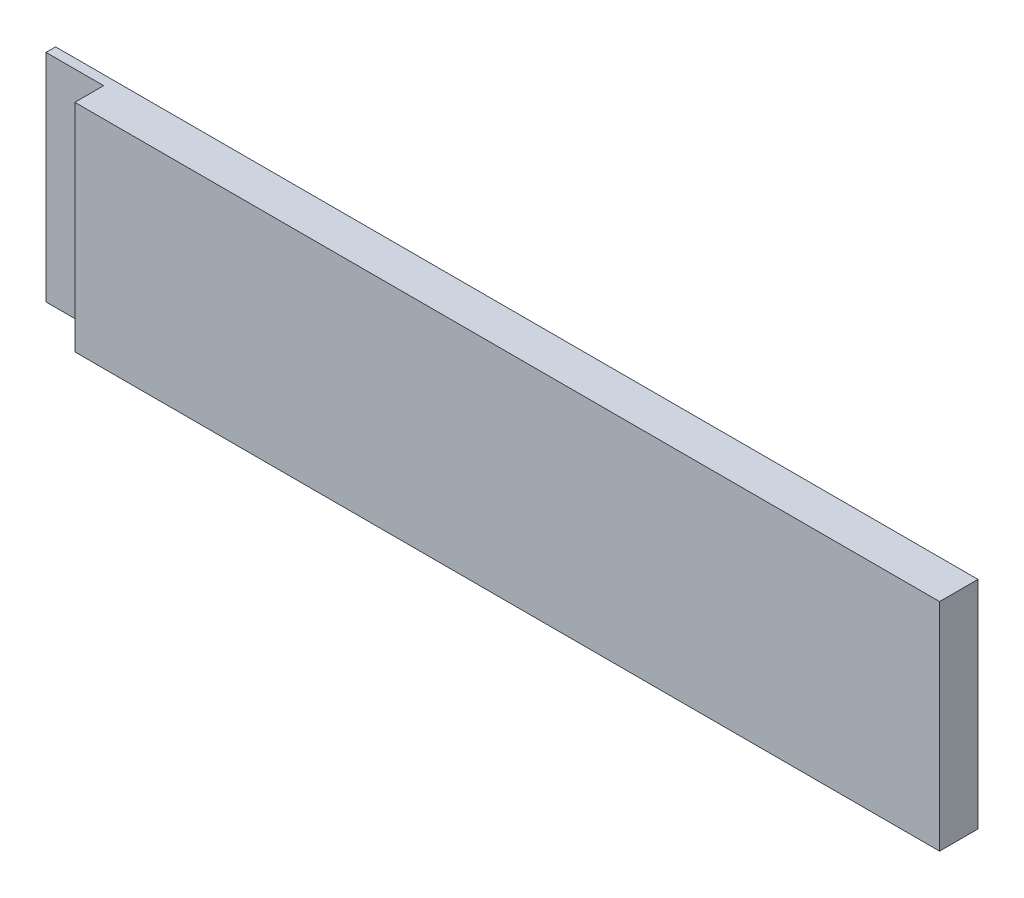
ISO-10303-21;
HEADER;
FILE_DESCRIPTION(('STEP AP214'),'2;1');
FILE_NAME('part.step','',(''),(''),'','','');
FILE_SCHEMA(('AUTOMOTIVE_DESIGN { 1 0 10303 214 1 1 1 1 }'));
ENDSEC;
DATA;
#1=APPLICATION_CONTEXT('core data for automotive mechanical design processes');
#2=APPLICATION_PROTOCOL_DEFINITION('international standard','automotive_design',2000,#1);
#3=PRODUCT_CONTEXT('',#1,'mechanical');
#4=PRODUCT('Part','Part','',(#3));
#5=PRODUCT_RELATED_PRODUCT_CATEGORY('part','',(#4));
#6=PRODUCT_DEFINITION_FORMATION('','',#4);
#7=PRODUCT_DEFINITION_CONTEXT('part definition',#1,'design');
#8=PRODUCT_DEFINITION('design','',#6,#7);
#9=PRODUCT_DEFINITION_SHAPE('','',#8);
#10=(LENGTH_UNIT() NAMED_UNIT(*) SI_UNIT(.MILLI.,.METRE.));
#11=(NAMED_UNIT(*) PLANE_ANGLE_UNIT() SI_UNIT($,.RADIAN.));
#12=(NAMED_UNIT(*) SI_UNIT($,.STERADIAN.) SOLID_ANGLE_UNIT());
#13=UNCERTAINTY_MEASURE_WITH_UNIT(LENGTH_MEASURE(1.E-05),#10,'distance_accuracy_value','');
#14=(GEOMETRIC_REPRESENTATION_CONTEXT(3) GLOBAL_UNCERTAINTY_ASSIGNED_CONTEXT((#13)) GLOBAL_UNIT_ASSIGNED_CONTEXT((#10,
#11,#12)) REPRESENTATION_CONTEXT('',''));
#15=CARTESIAN_POINT('',(0.,0.,0.));
#16=DIRECTION('',(0.,0.,1.));
#17=DIRECTION('',(1.,0.,0.));
#18=AXIS2_PLACEMENT_3D('',#15,#16,#17);
#19=CARTESIAN_POINT('',(-152.4,-35.7124,12.7));
#20=DIRECTION('',(0.,1.,0.));
#21=DIRECTION('',(0.,0.,1.));
#22=AXIS2_PLACEMENT_3D('',#19,#20,#21);
#23=PLANE('',#22);
#24=DIRECTION('',(0.,0.,1.));
#25=VECTOR('',#24,1.);
#26=CARTESIAN_POINT('',(-133.35,-35.7124,3.175));
#27=LINE('',#26,#25);
#28=CARTESIAN_POINT('',(-133.35,-35.7124,3.175));
#29=VERTEX_POINT('',#28);
#30=CARTESIAN_POINT('',(-133.35,-35.7124,12.7));
#31=VERTEX_POINT('',#30);
#32=EDGE_CURVE('E57',#29,#31,#27,.T.);
#33=ORIENTED_EDGE('',*,*,#32,.F.);
#34=DIRECTION('',(1.,0.,0.));
#35=VECTOR('',#34,1.);
#36=CARTESIAN_POINT('',(-152.4,-35.7124,3.175));
#37=LINE('',#36,#35);
#38=CARTESIAN_POINT('',(-152.4,-35.7124,3.175));
#39=VERTEX_POINT('',#38);
#40=EDGE_CURVE('E89',#39,#29,#37,.T.);
#41=ORIENTED_EDGE('',*,*,#40,.F.);
#42=DIRECTION('',(0.,0.,-1.));
#43=VECTOR('',#42,1.);
#44=CARTESIAN_POINT('',(-152.4,-35.7124,12.7));
#45=LINE('',#44,#43);
#46=CARTESIAN_POINT('',(-152.4,-35.7124,0.));
#47=VERTEX_POINT('',#46);
#48=EDGE_CURVE('E11',#39,#47,#45,.T.);
#49=ORIENTED_EDGE('',*,*,#48,.T.);
#50=DIRECTION('',(1.,0.,0.));
#51=VECTOR('',#50,1.);
#52=CARTESIAN_POINT('',(-152.4,-35.7124,0.));
#53=LINE('',#52,#51);
#54=CARTESIAN_POINT('',(152.4,-35.7124,0.));
#55=VERTEX_POINT('',#54);
#56=EDGE_CURVE('E85',#47,#55,#53,.T.);
#57=ORIENTED_EDGE('',*,*,#56,.T.);
#58=DIRECTION('',(0.,0.,-1.));
#59=VECTOR('',#58,1.);
#60=CARTESIAN_POINT('',(152.4,-35.7124,12.7));
#61=LINE('',#60,#59);
#62=CARTESIAN_POINT('',(152.4,-35.7124,12.7));
#63=VERTEX_POINT('',#62);
#64=EDGE_CURVE('E49',#63,#55,#61,.T.);
#65=ORIENTED_EDGE('',*,*,#64,.F.);
#66=DIRECTION('',(1.,0.,0.));
#67=VECTOR('',#66,1.);
#68=CARTESIAN_POINT('',(-152.4,-35.7124,12.7));
#69=LINE('',#68,#67);
#70=EDGE_CURVE('E65',#31,#63,#69,.T.);
#71=ORIENTED_EDGE('',*,*,#70,.F.);
#72=EDGE_LOOP('',(#33,#41,#49,#57,#65,#71));
#73=FACE_BOUND('',#72,.T.);
#74=ADVANCED_FACE('F39',(#73),#23,.F.);
#75=CARTESIAN_POINT('',(-152.4,35.7124,12.7));
#76=DIRECTION('',(0.,1.,0.));
#77=DIRECTION('',(0.,0.,1.));
#78=AXIS2_PLACEMENT_3D('',#75,#76,#77);
#79=PLANE('',#78);
#80=DIRECTION('',(1.,0.,0.));
#81=VECTOR('',#80,1.);
#82=CARTESIAN_POINT('',(-152.4,35.7124,3.175));
#83=LINE('',#82,#81);
#84=CARTESIAN_POINT('',(-152.4,35.7124,3.175));
#85=VERTEX_POINT('',#84);
#86=CARTESIAN_POINT('',(-133.35,35.7124,3.175));
#87=VERTEX_POINT('',#86);
#88=EDGE_CURVE('E140',#85,#87,#83,.T.);
#89=ORIENTED_EDGE('',*,*,#88,.T.);
#90=DIRECTION('',(0.,0.,1.));
#91=VECTOR('',#90,1.);
#92=CARTESIAN_POINT('',(-133.35,35.7124,3.175));
#93=LINE('',#92,#91);
#94=CARTESIAN_POINT('',(-133.35,35.7124,12.7));
#95=VERTEX_POINT('',#94);
#96=EDGE_CURVE('E108',#87,#95,#93,.T.);
#97=ORIENTED_EDGE('',*,*,#96,.T.);
#98=DIRECTION('',(1.,0.,0.));
#99=VECTOR('',#98,1.);
#100=CARTESIAN_POINT('',(-152.4,35.7124,12.7));
#101=LINE('',#100,#99);
#102=CARTESIAN_POINT('',(152.4,35.7124,12.7));
#103=VERTEX_POINT('',#102);
#104=EDGE_CURVE('E102',#95,#103,#101,.T.);
#105=ORIENTED_EDGE('',*,*,#104,.T.);
#106=DIRECTION('',(0.,0.,-1.));
#107=VECTOR('',#106,1.);
#108=CARTESIAN_POINT('',(152.4,35.7124,12.7));
#109=LINE('',#108,#107);
#110=CARTESIAN_POINT('',(152.4,35.7124,0.));
#111=VERTEX_POINT('',#110);
#112=EDGE_CURVE('E121',#103,#111,#109,.T.);
#113=ORIENTED_EDGE('',*,*,#112,.T.);
#114=DIRECTION('',(1.,0.,0.));
#115=VECTOR('',#114,1.);
#116=CARTESIAN_POINT('',(-152.4,35.7124,0.));
#117=LINE('',#116,#115);
#118=CARTESIAN_POINT('',(-152.4,35.7124,0.));
#119=VERTEX_POINT('',#118);
#120=EDGE_CURVE('E107',#119,#111,#117,.T.);
#121=ORIENTED_EDGE('',*,*,#120,.F.);
#122=DIRECTION('',(0.,0.,-1.));
#123=VECTOR('',#122,1.);
#124=CARTESIAN_POINT('',(-152.4,35.7124,12.7));
#125=LINE('',#124,#123);
#126=EDGE_CURVE('E43',#85,#119,#125,.T.);
#127=ORIENTED_EDGE('',*,*,#126,.F.);
#128=EDGE_LOOP('',(#89,#97,#105,#113,#121,#127));
#129=FACE_BOUND('',#128,.T.);
#130=ADVANCED_FACE('F153',(#129),#79,.T.);
#131=CARTESIAN_POINT('',(0.,0.,12.7));
#132=DIRECTION('',(0.,0.,-1.));
#133=DIRECTION('',(-1.,0.,0.));
#134=AXIS2_PLACEMENT_3D('',#131,#132,#133);
#135=PLANE('',#134);
#136=DIRECTION('',(0.,-1.,0.));
#137=VECTOR('',#136,1.);
#138=CARTESIAN_POINT('',(-133.35,35.7124,12.7));
#139=LINE('',#138,#137);
#140=EDGE_CURVE('E137',#95,#31,#139,.T.);
#141=ORIENTED_EDGE('',*,*,#140,.T.);
#142=ORIENTED_EDGE('',*,*,#70,.T.);
#143=DIRECTION('',(0.,1.,0.));
#144=VECTOR('',#143,1.);
#145=CARTESIAN_POINT('',(152.4,-35.7124,12.7));
#146=LINE('',#145,#144);
#147=EDGE_CURVE('E127',#63,#103,#146,.T.);
#148=ORIENTED_EDGE('',*,*,#147,.T.);
#149=ORIENTED_EDGE('',*,*,#104,.F.);
#150=EDGE_LOOP('',(#141,#142,#148,#149));
#151=FACE_BOUND('',#150,.T.);
#152=ADVANCED_FACE('F165',(#151),#135,.F.);
#153=CARTESIAN_POINT('',(-152.4,-35.7124,12.7));
#154=DIRECTION('',(-1.,0.,0.));
#155=DIRECTION('',(0.,0.,1.));
#156=AXIS2_PLACEMENT_3D('',#153,#154,#155);
#157=PLANE('',#156);
#158=DIRECTION('',(0.,-1.,0.));
#159=VECTOR('',#158,1.);
#160=CARTESIAN_POINT('',(-152.4,35.7124,3.175));
#161=LINE('',#160,#159);
#162=EDGE_CURVE('E136',#85,#39,#161,.T.);
#163=ORIENTED_EDGE('',*,*,#162,.F.);
#164=ORIENTED_EDGE('',*,*,#126,.T.);
#165=DIRECTION('',(0.,1.,0.));
#166=VECTOR('',#165,1.);
#167=CARTESIAN_POINT('',(-152.4,-35.7124,0.));
#168=LINE('',#167,#166);
#169=EDGE_CURVE('E98',#47,#119,#168,.T.);
#170=ORIENTED_EDGE('',*,*,#169,.F.);
#171=ORIENTED_EDGE('',*,*,#48,.F.);
#172=EDGE_LOOP('',(#163,#164,#170,#171));
#173=FACE_BOUND('',#172,.T.);
#174=ADVANCED_FACE('F41',(#173),#157,.T.);
#175=CARTESIAN_POINT('',(152.4,-35.7124,12.7));
#176=DIRECTION('',(-1.,0.,0.));
#177=DIRECTION('',(0.,0.,1.));
#178=AXIS2_PLACEMENT_3D('',#175,#176,#177);
#179=PLANE('',#178);
#180=DIRECTION('',(0.,1.,0.));
#181=VECTOR('',#180,1.);
#182=CARTESIAN_POINT('',(152.4,-35.7124,0.));
#183=LINE('',#182,#181);
#184=EDGE_CURVE('E100',#55,#111,#183,.T.);
#185=ORIENTED_EDGE('',*,*,#184,.T.);
#186=ORIENTED_EDGE('',*,*,#112,.F.);
#187=ORIENTED_EDGE('',*,*,#147,.F.);
#188=ORIENTED_EDGE('',*,*,#64,.T.);
#189=EDGE_LOOP('',(#185,#186,#187,#188));
#190=FACE_BOUND('',#189,.T.);
#191=ADVANCED_FACE('F167',(#190),#179,.F.);
#192=CARTESIAN_POINT('',(0.,0.,0.));
#193=DIRECTION('',(0.,0.,-1.));
#194=DIRECTION('',(-1.,0.,0.));
#195=AXIS2_PLACEMENT_3D('',#192,#193,#194);
#196=PLANE('',#195);
#197=ORIENTED_EDGE('',*,*,#169,.T.);
#198=ORIENTED_EDGE('',*,*,#120,.T.);
#199=ORIENTED_EDGE('',*,*,#184,.F.);
#200=ORIENTED_EDGE('',*,*,#56,.F.);
#201=EDGE_LOOP('',(#197,#198,#199,#200));
#202=FACE_BOUND('',#201,.T.);
#203=ADVANCED_FACE('F96',(#202),#196,.T.);
#204=CARTESIAN_POINT('',(-133.35,35.7124,3.175));
#205=DIRECTION('',(-1.,0.,0.));
#206=DIRECTION('',(0.,0.,1.));
#207=AXIS2_PLACEMENT_3D('',#204,#205,#206);
#208=PLANE('',#207);
#209=ORIENTED_EDGE('',*,*,#140,.F.);
#210=ORIENTED_EDGE('',*,*,#96,.F.);
#211=DIRECTION('',(0.,-1.,0.));
#212=VECTOR('',#211,1.);
#213=CARTESIAN_POINT('',(-133.35,35.7124,3.175));
#214=LINE('',#213,#212);
#215=EDGE_CURVE('E146',#87,#29,#214,.T.);
#216=ORIENTED_EDGE('',*,*,#215,.T.);
#217=ORIENTED_EDGE('',*,*,#32,.T.);
#218=EDGE_LOOP('',(#209,#210,#216,#217));
#219=FACE_BOUND('',#218,.T.);
#220=ADVANCED_FACE('F164',(#219),#208,.T.);
#221=CARTESIAN_POINT('',(0.,0.,3.175));
#222=DIRECTION('',(0.,0.,-1.));
#223=DIRECTION('',(-1.,0.,0.));
#224=AXIS2_PLACEMENT_3D('',#221,#222,#223);
#225=PLANE('',#224);
#226=ORIENTED_EDGE('',*,*,#88,.F.);
#227=ORIENTED_EDGE('',*,*,#162,.T.);
#228=ORIENTED_EDGE('',*,*,#40,.T.);
#229=ORIENTED_EDGE('',*,*,#215,.F.);
#230=EDGE_LOOP('',(#226,#227,#228,#229));
#231=FACE_BOUND('',#230,.T.);
#232=ADVANCED_FACE('F160',(#231),#225,.F.);
#233=CLOSED_SHELL('',(#74,#130,#152,#174,#191,#203,#220,#232));
#234=MANIFOLD_SOLID_BREP('B2',#233);
#235=ADVANCED_BREP_SHAPE_REPRESENTATION('',(#18,#234),#14);
#236=SHAPE_DEFINITION_REPRESENTATION(#9,#235);
ENDSEC;
END-ISO-10303-21;
